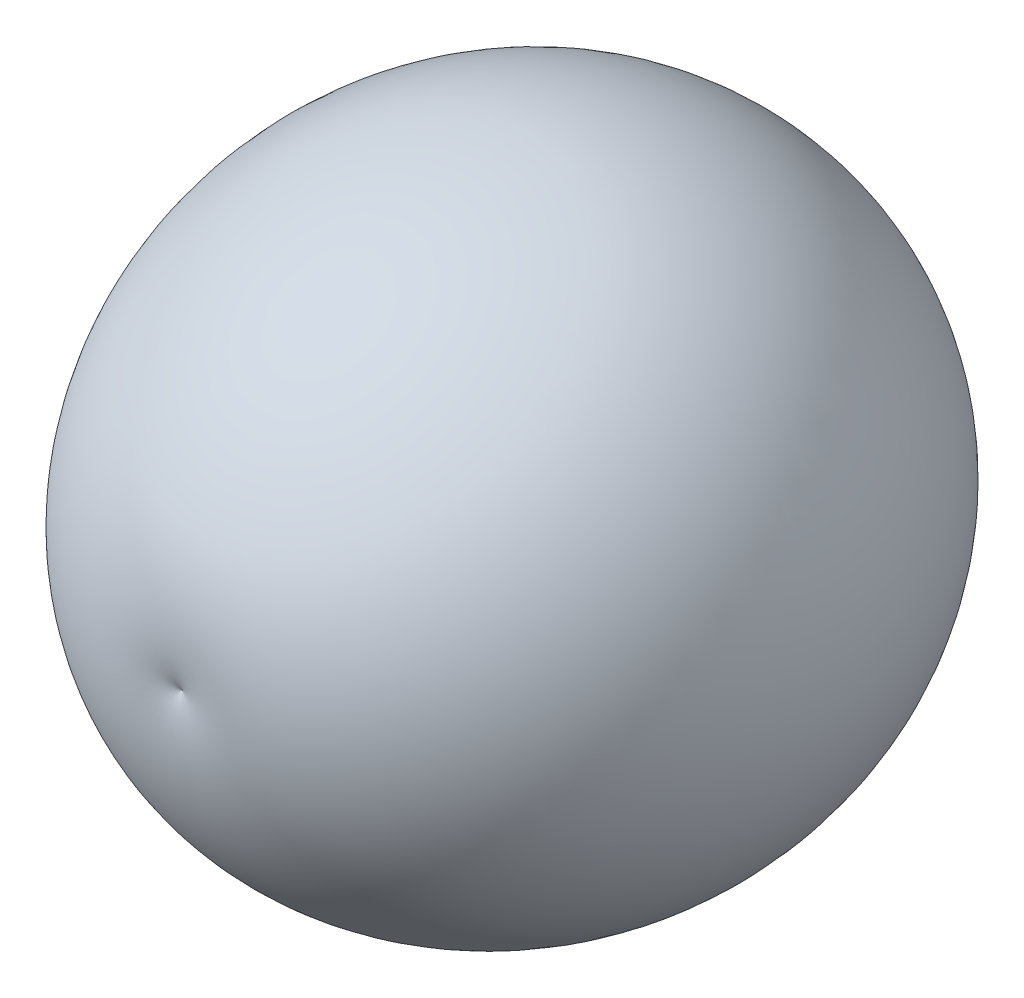
ISO-10303-21;
HEADER;
FILE_DESCRIPTION(('STEP AP214'),'2;1');
FILE_NAME('part.step','',(''),(''),'','','');
FILE_SCHEMA(('AUTOMOTIVE_DESIGN { 1 0 10303 214 1 1 1 1 }'));
ENDSEC;
DATA;
#1=APPLICATION_CONTEXT('core data for automotive mechanical design processes');
#2=APPLICATION_PROTOCOL_DEFINITION('international standard','automotive_design',2000,#1);
#3=PRODUCT_CONTEXT('',#1,'mechanical');
#4=PRODUCT('Part','Part','',(#3));
#5=PRODUCT_RELATED_PRODUCT_CATEGORY('part','',(#4));
#6=PRODUCT_DEFINITION_FORMATION('','',#4);
#7=PRODUCT_DEFINITION_CONTEXT('part definition',#1,'design');
#8=PRODUCT_DEFINITION('design','',#6,#7);
#9=PRODUCT_DEFINITION_SHAPE('','',#8);
#10=(LENGTH_UNIT() NAMED_UNIT(*) SI_UNIT(.MILLI.,.METRE.));
#11=(NAMED_UNIT(*) PLANE_ANGLE_UNIT() SI_UNIT($,.RADIAN.));
#12=(NAMED_UNIT(*) SI_UNIT($,.STERADIAN.) SOLID_ANGLE_UNIT());
#13=UNCERTAINTY_MEASURE_WITH_UNIT(LENGTH_MEASURE(1.E-05),#10,'distance_accuracy_value','');
#14=(GEOMETRIC_REPRESENTATION_CONTEXT(3) GLOBAL_UNCERTAINTY_ASSIGNED_CONTEXT((#13)) GLOBAL_UNIT_ASSIGNED_CONTEXT((#10,
#11,#12)) REPRESENTATION_CONTEXT('',''));
#15=CARTESIAN_POINT('',(0.,0.,0.));
#16=DIRECTION('',(0.,0.,1.));
#17=DIRECTION('',(1.,0.,0.));
#18=AXIS2_PLACEMENT_3D('',#15,#16,#17);
#19=CARTESIAN_POINT('',(0.,0.,0.));
#20=CARTESIAN_POINT('',(0.0479863208414198,0.,0.0321703262097621));
#21=CARTESIAN_POINT('',(0.145134861789436,0.,0.0946417333582174));
#22=CARTESIAN_POINT('',(0.344202177758364,0.,0.21201211272841));
#23=CARTESIAN_POINT('',(0.649410607303967,0.,0.376321721449864));
#24=CARTESIAN_POINT('',(1.01178827318945,0.,0.55573000531085));
#25=CARTESIAN_POINT('',(1.43242484901815,0.,0.747093766717319));
#26=CARTESIAN_POINT('',(1.85803108837698,0.,0.92703883952085));
#27=CARTESIAN_POINT('',(2.39525808021472,0.,1.13920780148028));
#28=CARTESIAN_POINT('',(3.05778948779677,0.,1.37937360942628));
#29=CARTESIAN_POINT('',(3.8483873557048,0.,1.63802458522606));
#30=CARTESIAN_POINT('',(5.00215548509438,0.,1.97326411091214));
#31=CARTESIAN_POINT('',(6.41543920889024,0.,2.32276693782149));
#32=CARTESIAN_POINT('',(8.08061631008642,0.,2.6581228022764));
#33=CARTESIAN_POINT('',(10.0715697690005,0.,2.96538096190307));
#34=CARTESIAN_POINT('',(12.1467731358914,0.,3.19521110168914));
#35=CARTESIAN_POINT('',(14.3027932474102,0.,3.3457270509509));
#36=CARTESIAN_POINT('',(16.5362981719613,0.,3.41472517118732));
#37=CARTESIAN_POINT('',(19.707943204201,0.,3.39857422575509));
#38=CARTESIAN_POINT('',(23.0648185665003,0.,3.20532305357208));
#39=CARTESIAN_POINT('',(26.5955767347121,0.,2.82286693544867));
#40=CARTESIAN_POINT('',(30.2890453566047,0.,2.23743411660227));
#41=CARTESIAN_POINT('',(33.2255239502267,0.,1.66595198747073));
#42=CARTESIAN_POINT('',(36.8702423586563,0.,0.829296860920729));
#43=CARTESIAN_POINT('',(41.1979321500905,0.,-0.360314402722741));
#44=CARTESIAN_POINT('',(46.1718067459154,0.,-2.00056274204767));
#45=CARTESIAN_POINT('',(53.2002912903795,0.,-4.76669159526689));
#46=CARTESIAN_POINT('',(64.0662718649685,0.,-9.97458895910756));
#47=CARTESIAN_POINT('',(78.087998646259,0.,-18.8247698956139));
#48=CARTESIAN_POINT('',(94.0780397445662,0.,-32.6027109217914));
#49=CARTESIAN_POINT('',(109.52213039309,0.,-51.0060171862149));
#50=CARTESIAN_POINT('',(121.993292050706,0.,-71.5305091027322));
#51=CARTESIAN_POINT('',(130.158145085191,0.,-90.8896994358752));
#52=CARTESIAN_POINT('',(135.107715283452,0.,-108.176937844796));
#53=CARTESIAN_POINT('',(138.376785104319,0.,-125.838291985251));
#54=CARTESIAN_POINT('',(139.680812788273,0.,-140.76642516533));
#55=CARTESIAN_POINT('',(139.539902179521,0.,-155.751586100404));
#56=CARTESIAN_POINT('',(137.941693761859,0.,-170.634378490998));
#57=CARTESIAN_POINT('',(135.786987086063,0.,-182.413843163642));
#58=CARTESIAN_POINT('',(132.757744461827,0.,-193.999573998505));
#59=CARTESIAN_POINT('',(128.859639270352,0.,-205.322900290728));
#60=CARTESIAN_POINT('',(124.10285216473,0.,-216.313556294856));
#61=CARTESIAN_POINT('',(118.502761106392,0.,-226.899854398991));
#62=CARTESIAN_POINT('',(112.080527474755,0.,-237.00904172534));
#63=CARTESIAN_POINT('',(104.863770349494,0.,-246.56778748347));
#64=CARTESIAN_POINT('',(96.887156218714,0.,-255.502869604249));
#65=CARTESIAN_POINT('',(88.1929543709923,0.,-263.742039758038));
#66=CARTESIAN_POINT('',(80.0016390851506,0.,-270.280947104679));
#67=CARTESIAN_POINT('',(72.6000508032797,0.,-275.365034326223));
#68=CARTESIAN_POINT('',(66.1992969321919,0.,-279.23517287352));
#69=CARTESIAN_POINT('',(60.9479068793384,0.,-282.103901172911));
#70=CARTESIAN_POINT('',(55.5750626208034,0.,-284.738225891423));
#71=CARTESIAN_POINT('',(50.0906272085949,0.,-287.131575809175));
#72=CARTESIAN_POINT('',(44.5048242990487,0.,-289.277874601188));
#73=CARTESIAN_POINT('',(38.828450490917,0.,-291.171584885399));
#74=CARTESIAN_POINT('',(33.0724414368496,0.,-292.807749888578));
#75=CARTESIAN_POINT('',(27.2485048282709,0.,-294.18203213004));
#76=CARTESIAN_POINT('',(22.1029726390701,0.,-295.152158828091));
#77=CARTESIAN_POINT('',(18.0350942367526,0.,-295.760536134997));
#78=CARTESIAN_POINT('',(15.065690799796,0.,-296.124160412145));
#79=CARTESIAN_POINT('',(13.2078311469778,0.,-296.323196206307));
#80=CARTESIAN_POINT('',(11.7170445283904,0.,-296.465459961173));
#81=CARTESIAN_POINT('',(10.2307831062727,0.,-296.590734539412));
#82=CARTESIAN_POINT('',(8.7323035040926,0.,-296.698998443845));
#83=CARTESIAN_POINT('',(7.21850583353523,0.,-296.792207093271));
#84=CARTESIAN_POINT('',(5.64317292437782,0.,-296.869094234134));
#85=CARTESIAN_POINT('',(4.07854022025923,0.,-296.928362498182));
#86=CARTESIAN_POINT('',(2.61412262196328,0.,-296.96364404572));
#87=CARTESIAN_POINT('',(1.46310281447099,0.,-296.981286093145));
#88=CARTESIAN_POINT('',(0.559088915756661,0.,-296.986326825011));
#89=CARTESIAN_POINT('',(0.18464869407914,0.,-296.987166947344));
#90=CARTESIAN_POINT('',(-1.6255277496225E-10,0.,-296.987166947343));
#91=B_SPLINE_CURVE_WITH_KNOTS('',4,(#19,#20,#21,#22,#23,#24,#25,#26,#27,#28,#29,#30,#31,#32,#33,
#34,#35,#36,#37,#38,#39,#40,#41,#42,#43,#44,#45,#46,#47,#48,#49,#50,#51,#52,#53,#54,#55,#56,#57,
#58,#59,#60,#61,#62,#63,#64,#65,#66,#67,#68,#69,#70,#71,#72,#73,#74,#75,#76,#77,#78,#79,#80,#81,
#82,#83,#84,#85,#86,#87,#88,#89,#90),.UNSPECIFIED.,.F.,.F.,(5,1,1,1,1,1,1,1,1,1,1,1,1,1,1,1,1,1,
1,1,1,1,1,1,1,1,1,1,1,1,1,1,1,1,1,1,1,1,1,1,1,1,1,1,1,1,1,1,1,1,1,1,1,1,1,1,1,1,1,1,1,1,1,1,1,1,
1,1,5),(0.,0.000458674137903002,0.000917348275806004,0.00183469655161201,0.00275204482741801,
0.00366939310322401,0.00458674137903002,0.00550408965483602,0.00733878620644803,
0.00926515636266851,0.011191526518889,0.01504426683133,0.0188970071437709,0.0227497474562119,
0.0271852996393439,0.0316208518224759,0.0360564040056079,0.0404919561887399,0.0523686588342327,
0.0583070101569791,0.0642453614797256,0.0701838779914301,0.0761223945031346,0.0879994275265436,
0.0998762104815178,0.111752993436492,0.136078927552254,0.183585527710117,0.231092168472181,
0.278599012887844,0.326105735545153,0.373612429891048,0.3973658263705,0.421119222849953,
0.468625937647202,0.492379295105644,0.516132652564086,0.539886019817049,0.563639387070011,
0.587392748350968,0.611146109631925,0.634899475453517,0.658652841275109,0.682406203776029,
0.706159566276949,0.7299129268991,0.753666287521252,0.765542968356271,0.777419649191289,
0.789296330026308,0.801173010861327,0.81304968982068,0.824926368780033,0.836803047739386,
0.848679726698739,0.860556404824788,0.872433082950836,0.87837142201386,0.881340591545372,
0.884309761076884,0.887278930608396,0.890248100139908,0.89321726967142,0.896186439202932,
0.899412568707219,0.902638698211505,0.905864827715792,0.907477892467935,0.909090957220078),.UNSPECIFIED.);
#92=CARTESIAN_POINT('',(0.,0.,-296.987166947343));
#93=DIRECTION('',(0.,0.,-1.));
#94=AXIS1_PLACEMENT('',#92,#93);
#95=SURFACE_OF_REVOLUTION('',#91,#94);
#96=CARTESIAN_POINT('',(0.,0.,-296.987166947343));
#97=VERTEX_POINT('',#96);
#98=VERTEX_LOOP('',#97);
#99=FACE_BOUND('',#98,.T.);
#100=CARTESIAN_POINT('',(0.,0.,0.));
#101=VERTEX_POINT('',#100);
#102=VERTEX_LOOP('',#101);
#103=FACE_BOUND('',#102,.T.);
#104=ADVANCED_FACE('F40',(#99,#103),#95,.T.);
#105=CLOSED_SHELL('',(#104));
#106=MANIFOLD_SOLID_BREP('B2',#105);
#107=ADVANCED_BREP_SHAPE_REPRESENTATION('',(#18,#106),#14);
#108=SHAPE_DEFINITION_REPRESENTATION(#9,#107);
ENDSEC;
END-ISO-10303-21;
